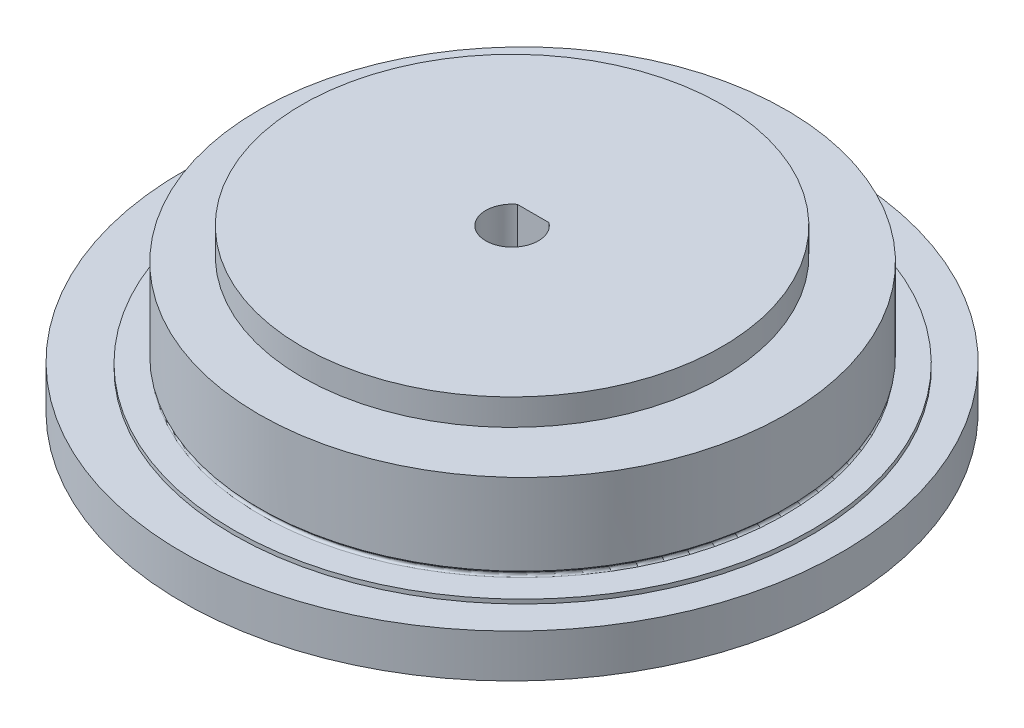
ISO-10303-21;
HEADER;
FILE_DESCRIPTION(('STEP AP214'),'2;1');
FILE_NAME('part.step','',(''),(''),'','','');
FILE_SCHEMA(('AUTOMOTIVE_DESIGN { 1 0 10303 214 1 1 1 1 }'));
ENDSEC;
DATA;
#1=APPLICATION_CONTEXT('core data for automotive mechanical design processes');
#2=APPLICATION_PROTOCOL_DEFINITION('international standard','automotive_design',2000,#1);
#3=PRODUCT_CONTEXT('',#1,'mechanical');
#4=PRODUCT('Part','Part','',(#3));
#5=PRODUCT_RELATED_PRODUCT_CATEGORY('part','',(#4));
#6=PRODUCT_DEFINITION_FORMATION('','',#4);
#7=PRODUCT_DEFINITION_CONTEXT('part definition',#1,'design');
#8=PRODUCT_DEFINITION('design','',#6,#7);
#9=PRODUCT_DEFINITION_SHAPE('','',#8);
#10=(LENGTH_UNIT() NAMED_UNIT(*) SI_UNIT(.MILLI.,.METRE.));
#11=(NAMED_UNIT(*) PLANE_ANGLE_UNIT() SI_UNIT($,.RADIAN.));
#12=(NAMED_UNIT(*) SI_UNIT($,.STERADIAN.) SOLID_ANGLE_UNIT());
#13=UNCERTAINTY_MEASURE_WITH_UNIT(LENGTH_MEASURE(1.E-05),#10,'distance_accuracy_value','');
#14=(GEOMETRIC_REPRESENTATION_CONTEXT(3) GLOBAL_UNCERTAINTY_ASSIGNED_CONTEXT((#13)) GLOBAL_UNIT_ASSIGNED_CONTEXT((#10,
#11,#12)) REPRESENTATION_CONTEXT('',''));
#15=CARTESIAN_POINT('',(0.,0.,0.));
#16=DIRECTION('',(0.,0.,1.));
#17=DIRECTION('',(1.,0.,0.));
#18=AXIS2_PLACEMENT_3D('',#15,#16,#17);
#19=CARTESIAN_POINT('',(0.,10.8,0.));
#20=DIRECTION('',(0.,-1.,0.));
#21=DIRECTION('',(0.,0.,-1.));
#22=AXIS2_PLACEMENT_3D('',#19,#20,#21);
#23=CYLINDRICAL_SURFACE('',#22,25.);
#24=CARTESIAN_POINT('',(0.,8.3,0.));
#25=DIRECTION('',(0.,1.,0.));
#26=DIRECTION('',(0.,0.,1.));
#27=AXIS2_PLACEMENT_3D('',#24,#25,#26);
#28=CIRCLE('',#27,25.);
#29=CARTESIAN_POINT('',(0.,8.3,25.));
#30=VERTEX_POINT('',#29);
#31=EDGE_CURVE('E240',#30,#30,#28,.T.);
#32=ORIENTED_EDGE('',*,*,#31,.F.);
#33=EDGE_LOOP('',(#32));
#34=FACE_BOUND('',#33,.T.);
#35=CARTESIAN_POINT('',(-4.27414110874898,0.600000000000003,-24.6319247681236));
#36=CARTESIAN_POINT('',(-4.34505262191747,0.691030760315778,-24.6196186159859));
#37=CARTESIAN_POINT('',(-4.4121740191949,0.78506279709633,-24.6076576214617));
#38=CARTESIAN_POINT('',(-4.53840363012672,0.978477091958014,-24.5846909681928));
#39=CARTESIAN_POINT('',(-4.59751141349638,1.07785963693054,-24.5736853607583));
#40=CARTESIAN_POINT('',(-4.7072718139828,1.28131024756714,-24.5528961312384));
#41=CARTESIAN_POINT('',(-4.75792463520306,1.38537820004806,-24.5431124796562));
#42=CARTESIAN_POINT('',(-4.85039991708168,1.59748485564613,-24.5250044528434));
#43=CARTESIAN_POINT('',(-4.89222273007305,1.70552340012757,-24.5166800193897));
#44=CARTESIAN_POINT('',(-4.96674980298479,1.92491657348787,-24.5016906246384));
#45=CARTESIAN_POINT('',(-4.99944634811973,2.03627392040853,-24.4950270678499));
#46=CARTESIAN_POINT('',(-5.05542560453281,2.26146789744916,-24.4835350794684));
#47=CARTESIAN_POINT('',(-5.07870483653767,2.37530542754569,-24.4787073261615));
#48=CARTESIAN_POINT('',(-5.11562702937456,2.60449561701758,-24.4710178804894));
#49=CARTESIAN_POINT('',(-5.12927847487715,2.71984685085014,-24.4681544570818));
#50=CARTESIAN_POINT('',(-5.14686935471558,2.95136295802098,-24.4644602879653));
#51=CARTESIAN_POINT('',(-5.15080524504081,3.06752811276799,-24.4636302840016));
#52=CARTESIAN_POINT('',(-5.14893430030416,3.29824295563418,-24.4640241182816));
#53=CARTESIAN_POINT('',(-5.14325528733625,3.41279374175295,-24.4652210106847));
#54=CARTESIAN_POINT('',(-5.12244139795184,3.64103535700627,-24.4695873731959));
#55=CARTESIAN_POINT('',(-5.10730306205712,3.75472585611242,-24.4727575649805));
#56=CARTESIAN_POINT('',(-5.06768622559179,3.98038743179545,-24.4809919648029));
#57=CARTESIAN_POINT('',(-5.04320912181831,4.09235876290378,-24.4860558895933));
#58=CARTESIAN_POINT('',(-4.9851159992354,4.31382161103307,-24.4979485941064));
#59=CARTESIAN_POINT('',(-4.95149657757838,4.42331218822502,-24.5047780309206));
#60=CARTESIAN_POINT('',(-4.83732390974164,4.74673848300007,-24.5276661623403));
#61=CARTESIAN_POINT('',(-4.74339757734062,4.95596045924484,-24.5461374841733));
#62=CARTESIAN_POINT('',(-4.5227540446558,5.35565275867674,-24.5877452666456));
#63=CARTESIAN_POINT('',(-4.39603613067479,5.5461226736073,-24.6108818288198));
#64=CARTESIAN_POINT('',(-4.11071521791974,5.90676024463954,-24.6601561784816));
#65=CARTESIAN_POINT('',(-3.95157934116191,6.07650074478661,-24.6863404920217));
#66=CARTESIAN_POINT('',(-3.607250453221,6.38705434312243,-24.7389980717553));
#67=CARTESIAN_POINT('',(-3.42205463968302,6.527864326257,-24.765471368742));
#68=CARTESIAN_POINT('',(-3.02814172177661,6.77825872054242,-24.8167328104405));
#69=CARTESIAN_POINT('',(-2.81916317887071,6.88743748888901,-24.8414962047766));
#70=CARTESIAN_POINT('',(-2.38536840983069,7.0689962304069,-24.8868945892071));
#71=CARTESIAN_POINT('',(-2.16055310843929,7.14137835018982,-24.9075298200842));
#72=CARTESIAN_POINT('',(-1.70324162679995,7.24665432389415,-24.9429575777453));
#73=CARTESIAN_POINT('',(-1.47081800573248,7.27984824587216,-24.9577939130727));
#74=CARTESIAN_POINT('',(-1.00338412109003,7.30659443751356,-24.9809518044566));
#75=CARTESIAN_POINT('',(-0.768374090071174,7.30015024262091,-24.9892739414596));
#76=CARTESIAN_POINT('',(-0.305976782215305,7.24807286762429,-24.9991825277828));
#77=CARTESIAN_POINT('',(-0.0785286933235555,7.20299567950653,-25.0008626501215));
#78=CARTESIAN_POINT('',(0.365669963290388,7.07566240385783,-24.998312842062));
#79=CARTESIAN_POINT('',(0.582420596264551,6.99340654313916,-24.9940829477181));
#80=CARTESIAN_POINT('',(0.998840107689834,6.7942213745283,-24.9809069424065));
#81=CARTESIAN_POINT('',(1.1985305901376,6.677336782847,-24.9719669021504));
#82=CARTESIAN_POINT('',(1.57565939228854,6.41214847091262,-24.9510124757845));
#83=CARTESIAN_POINT('',(1.75309630349155,6.26384276351202,-24.9389978952233));
#84=CARTESIAN_POINT('',(2.0824717133853,5.93837305310876,-24.9136692514613));
#85=CARTESIAN_POINT('',(2.23414579498077,5.76094273094475,-24.9003436994574));
#86=CARTESIAN_POINT('',(2.50572632966306,5.38303535934477,-24.8744854040156));
#87=CARTESIAN_POINT('',(2.62563193031653,5.18255769169376,-24.8619526818584));
#88=CARTESIAN_POINT('',(2.77924025022984,4.8685946603569,-24.8450893818868));
#89=CARTESIAN_POINT('',(2.82615682313361,4.76143206727769,-24.8397794801961));
#90=CARTESIAN_POINT('',(2.91078910051821,4.54350849652825,-24.8300046089751));
#91=CARTESIAN_POINT('',(2.94850823295193,4.43274887699082,-24.8255393247893));
#92=CARTESIAN_POINT('',(3.01447516230899,4.20838235641678,-24.8176155827845));
#93=CARTESIAN_POINT('',(3.04272024617706,4.09477464977483,-24.8141574134073));
#94=CARTESIAN_POINT('',(3.08951065266847,3.86559296366645,-24.8083752124505));
#95=CARTESIAN_POINT('',(3.10805966195755,3.75001974881413,-24.8060507498326));
#96=CARTESIAN_POINT('',(3.13524983597395,3.51840630033341,-24.8026287983793));
#97=CARTESIAN_POINT('',(3.1439503201434,3.40237313321437,-24.8015239645103));
#98=CARTESIAN_POINT('',(3.15157858223744,3.17002406189209,-24.8005557886724));
#99=CARTESIAN_POINT('',(3.15051002512813,3.05370828008637,-24.8006919811185));
#100=CARTESIAN_POINT('',(3.13861292212023,2.82150851473511,-24.8022003999637));
#101=CARTESIAN_POINT('',(3.1277779646529,2.70562486507169,-24.8035734383427));
#102=CARTESIAN_POINT('',(3.09642619012885,2.47523885085143,-24.807506802285));
#103=CARTESIAN_POINT('',(3.07591294003851,2.36073599333074,-24.8100666904249));
#104=CARTESIAN_POINT('',(3.02543474665135,2.13422501016556,-24.8162726508769));
#105=CARTESIAN_POINT('',(2.99549835705382,2.02221042820814,-24.8199154399868));
#106=CARTESIAN_POINT('',(2.92638642072021,1.80115040351083,-24.8281588497727));
#107=CARTESIAN_POINT('',(2.88721431023388,1.69210387326638,-24.8327591141354));
#108=CARTESIAN_POINT('',(2.79995411501976,1.47780960834962,-24.842749089679));
#109=CARTESIAN_POINT('',(2.75187516575574,1.3725581121927,-24.8481379908013));
#110=CARTESIAN_POINT('',(2.64713353409062,1.16650181044388,-24.8595143885156));
#111=CARTESIAN_POINT('',(2.59047491776958,1.06569492752439,-24.865501601101));
#112=CARTESIAN_POINT('',(2.49043625958997,0.90390576135891,-24.8756765913543));
#113=CARTESIAN_POINT('',(2.4494341190013,0.841432781171271,-24.8797530488686));
#114=CARTESIAN_POINT('',(2.36419516769879,0.718898880698072,-24.8879972834881));
#115=CARTESIAN_POINT('',(2.31996399630949,0.658834026191226,-24.8921648928865));
#116=CARTESIAN_POINT('',(2.27414110874898,0.600000000000004,-24.8963507811386));
#117=B_SPLINE_CURVE_WITH_KNOTS('',3,(#35,#36,#37,#38,#39,#40,#41,#42,#43,#44,#45,#46,#47,#48,
#49,#50,#51,#52,#53,#54,#55,#56,#57,#58,#59,#60,#61,#62,#63,#64,#65,#66,#67,#68,#69,#70,#71,#72,
#73,#74,#75,#76,#77,#78,#79,#80,#81,#82,#83,#84,#85,#86,#87,#88,#89,#90,#91,#92,#93,#94,#95,#96,
#97,#98,#99,#100,#101,#102,#103,#104,#105,#106,#107,#108,#109,#110,#111,#112,#113,#114,#115,
#116),.UNSPECIFIED.,.F.,.F.,(4,2,2,2,2,2,2,2,2,2,2,2,2,2,2,2,2,2,2,2,2,2,2,2,2,2,2,2,2,2,2,2,2,
2,2,2,2,2,2,2,4),(0.,0.348038267559668,0.696095215367474,1.04414375983608,1.39217841392393,
1.74050639016638,2.08896294064228,2.43711202210864,2.78538808158098,3.12907036909893,
3.47287842225977,3.81663507228392,4.1605198469681,4.84729073612463,5.53407657386444,
6.23322463363967,6.93244793382758,7.64027702449846,8.34806481769771,9.05039711241701,
9.75266676489548,10.4449961344176,11.137321280371,11.8287562921967,12.5202350451086,
13.2184303986096,13.9166444846634,14.2676090364982,14.618442580669,14.9693765064011,
15.3201769019224,15.6688529291203,16.0173981519406,16.3661723588763,16.7148181242288,
17.0624174424898,17.4098876361879,17.7570033942441,18.1039551589215,18.3283672214327,
18.5523963276917),.UNSPECIFIED.);
#118=CARTESIAN_POINT('',(-4.27414110874898,0.6,-24.6319247681236));
#119=VERTEX_POINT('',#118);
#120=CARTESIAN_POINT('',(2.27414110874898,0.600000000000003,-24.8963507811386));
#121=VERTEX_POINT('',#120);
#122=EDGE_CURVE('E177',#119,#121,#117,.T.);
#123=ORIENTED_EDGE('',*,*,#122,.F.);
#124=CARTESIAN_POINT('',(0.,0.6,0.));
#125=DIRECTION('',(0.,1.,0.));
#126=DIRECTION('',(0.,0.,1.));
#127=AXIS2_PLACEMENT_3D('',#124,#125,#126);
#128=CIRCLE('',#127,25.);
#129=EDGE_CURVE('E137',#119,#121,#128,.T.);
#130=ORIENTED_EDGE('',*,*,#129,.T.);
#131=EDGE_LOOP('',(#123,#130));
#132=FACE_BOUND('',#131,.T.);
#133=ADVANCED_FACE('F41',(#34,#132),#23,.T.);
#134=CARTESIAN_POINT('',(-1.,0.,0.));
#135=DIRECTION('',(0.,-1.,0.));
#136=DIRECTION('',(0.,0.,-1.));
#137=AXIS2_PLACEMENT_3D('',#134,#135,#136);
#138=PLANE('',#137);
#139=DIRECTION('',(0.,0.,1.));
#140=VECTOR('',#139,1.);
#141=CARTESIAN_POINT('',(1.70185121722126,0.,-31.25));
#142=LINE('',#141,#140);
#143=CARTESIAN_POINT('',(1.70185121719412,-2.32889956620022E-11,-24.824575804788));
#144=VERTEX_POINT('',#143);
#145=CARTESIAN_POINT('',(1.70185121722126,0.,-27.3470967825552));
#146=VERTEX_POINT('',#145);
#147=EDGE_CURVE('E337',#144,#146,#142,.F.);
#148=ORIENTED_EDGE('',*,*,#147,.F.);
#149=CARTESIAN_POINT('',(0.,0.,0.));
#150=DIRECTION('',(0.,-1.,0.));
#151=DIRECTION('',(0.,0.,-1.));
#152=AXIS2_PLACEMENT_3D('',#149,#150,#151);
#153=CIRCLE('',#152,24.8828427124746);
#154=CARTESIAN_POINT('',(-3.70185121722126,0.,-24.6059374749126));
#155=VERTEX_POINT('',#154);
#156=EDGE_CURVE('E129',#144,#155,#153,.T.);
#157=ORIENTED_EDGE('',*,*,#156,.T.);
#158=DIRECTION('',(0.,0.,1.));
#159=VECTOR('',#158,1.);
#160=CARTESIAN_POINT('',(-3.70185121722126,0.,-31.25));
#161=LINE('',#160,#159);
#162=CARTESIAN_POINT('',(-3.70185121722126,0.,-27.1487807749364));
#163=VERTEX_POINT('',#162);
#164=EDGE_CURVE('E62',#163,#155,#161,.T.);
#165=ORIENTED_EDGE('',*,*,#164,.F.);
#166=CARTESIAN_POINT('',(0.,0.,0.));
#167=DIRECTION('',(0.,1.,0.));
#168=DIRECTION('',(0.,0.,1.));
#169=AXIS2_PLACEMENT_3D('',#166,#167,#168);
#170=CIRCLE('',#169,27.4);
#171=EDGE_CURVE('E260',#163,#146,#170,.T.);
#172=ORIENTED_EDGE('',*,*,#171,.T.);
#173=EDGE_LOOP('',(#148,#157,#165,#172));
#174=FACE_BOUND('',#173,.T.);
#175=ADVANCED_FACE('F214',(#174),#138,.F.);
#176=CARTESIAN_POINT('',(-1.,-2.,0.));
#177=DIRECTION('',(0.,1.,0.));
#178=DIRECTION('',(0.,0.,1.));
#179=AXIS2_PLACEMENT_3D('',#176,#177,#178);
#180=CYLINDRICAL_SURFACE('',#179,31.25);
#181=CARTESIAN_POINT('',(-1.,-4.5,0.));
#182=DIRECTION('',(0.,-1.,0.));
#183=DIRECTION('',(0.,0.,-1.));
#184=AXIS2_PLACEMENT_3D('',#181,#182,#183);
#185=CIRCLE('',#184,31.25);
#186=CARTESIAN_POINT('',(-1.,-4.5,-31.25));
#187=VERTEX_POINT('',#186);
#188=EDGE_CURVE('E258',#187,#187,#185,.T.);
#189=ORIENTED_EDGE('',*,*,#188,.F.);
#190=EDGE_LOOP('',(#189));
#191=FACE_BOUND('',#190,.T.);
#192=CARTESIAN_POINT('',(1.14941852602047,-0.4,-31.1759923659216));
#193=CARTESIAN_POINT('',(1.05018927384685,-0.46009450659294,-31.1828379795394));
#194=CARTESIAN_POINT('',(0.948412663402869,-0.516017189269527,-31.1893748836995));
#195=CARTESIAN_POINT('',(0.740498763905845,-0.619164885281527,-31.2016655987921));
#196=CARTESIAN_POINT('',(0.634361494396882,-0.666389937593728,-31.2074194132337));
#197=CARTESIAN_POINT('',(0.418549865240858,-0.751753118082809,-31.217973915197));
#198=CARTESIAN_POINT('',(0.308878543868644,-0.789898827111896,-31.2227753973119));
#199=CARTESIAN_POINT('',(0.0866899916221706,-0.85687733633233,-31.231297739614));
#200=CARTESIAN_POINT('',(-0.0258271614023855,-0.885710390981336,-31.2350186293269));
#201=CARTESIAN_POINT('',(-0.252963747038846,-0.933860981084216,-31.2412763893917));
#202=CARTESIAN_POINT('',(-0.367584077148125,-0.953174351376509,-31.2438127414458));
#203=CARTESIAN_POINT('',(-0.598101605263813,-0.982127336717654,-31.247628223645));
#204=CARTESIAN_POINT('',(-0.713999233476503,-0.991763585087078,-31.2489069162461));
#205=CARTESIAN_POINT('',(-0.946201630625096,-1.00127786827916,-31.2501693693157));
#206=CARTESIAN_POINT('',(-1.06250640030056,-1.00115588536714,-31.2501531274306));
#207=CARTESIAN_POINT('',(-1.29468823026529,-0.991154528256743,-31.2488261602018));
#208=CARTESIAN_POINT('',(-1.41056529082343,-0.98127516019325,-31.2475154356718));
#209=CARTESIAN_POINT('',(-1.6406867581142,-0.951881541155404,-31.2436428930292));
#210=CARTESIAN_POINT('',(-1.7549352409594,-0.93239864111939,-31.2410851461422));
#211=CARTESIAN_POINT('',(-1.9813329672195,-0.883965859779933,-31.234793180704));
#212=CARTESIAN_POINT('',(-2.09348294005519,-0.855019335081593,-31.2310593792988));
#213=CARTESIAN_POINT('',(-2.3148054602762,-0.787911294930692,-31.2225245612551));
#214=CARTESIAN_POINT('',(-2.42398124070208,-0.749760269432725,-31.2177247599801));
#215=CARTESIAN_POINT('',(-2.63868616580703,-0.664516648439489,-31.2071906854103));
#216=CARTESIAN_POINT('',(-2.74421721287012,-0.617428803543969,-31.2014569088231));
#217=CARTESIAN_POINT('',(-2.89904318432458,-0.540453049966208,-31.1922875069476));
#218=CARTESIAN_POINT('',(-2.94998313499199,-0.513791811600203,-31.1891425363875));
#219=CARTESIAN_POINT('',(-3.05062518607747,-0.458424705550807,-31.1826871070559));
#220=CARTESIAN_POINT('',(-3.10032908965055,-0.429722084635024,-31.1793769134621));
#221=CARTESIAN_POINT('',(-3.14941852602047,-0.400000000000001,-31.1759923659216));
#222=B_SPLINE_CURVE_WITH_KNOTS('',3,(#192,#193,#194,#195,#196,#197,#198,#199,#200,#201,#202,
#203,#204,#205,#206,#207,#208,#209,#210,#211,#212,#213,#214,#215,#216,#217,#218,#219,#220,#221),
.UNSPECIFIED.,.F.,.F.,(4,2,2,2,2,2,2,2,2,2,2,2,2,2,4),(0.,0.348526314591998,0.697051067291212,
1.04528378823434,1.3935069933105,1.74188242205719,2.09037900898526,2.43887622927331,
2.78737323044635,3.1347400159154,3.4819837290399,3.82883355812322,4.17549952393379,
4.34820013053028,4.52063195216404),.UNSPECIFIED.);
#223=CARTESIAN_POINT('',(1.14941852602047,-0.4,-31.1759923659216));
#224=VERTEX_POINT('',#223);
#225=CARTESIAN_POINT('',(-3.14941852602047,-0.4,-31.1759923659216));
#226=VERTEX_POINT('',#225);
#227=EDGE_CURVE('E198',#224,#226,#222,.T.);
#228=ORIENTED_EDGE('',*,*,#227,.F.);
#229=CARTESIAN_POINT('',(-1.,-0.4,0.));
#230=DIRECTION('',(0.,1.,0.));
#231=DIRECTION('',(0.,0.,1.));
#232=AXIS2_PLACEMENT_3D('',#229,#230,#231);
#233=CIRCLE('',#232,31.25);
#234=EDGE_CURVE('E251',#226,#224,#233,.T.);
#235=ORIENTED_EDGE('',*,*,#234,.F.);
#236=EDGE_LOOP('',(#228,#235));
#237=FACE_BOUND('',#236,.T.);
#238=ADVANCED_FACE('F208',(#191,#237),#180,.T.);
#239=CARTESIAN_POINT('',(-1.,-0.4,0.));
#240=DIRECTION('',(0.,1.,0.));
#241=DIRECTION('',(0.,0.,1.));
#242=AXIS2_PLACEMENT_3D('',#239,#240,#241);
#243=PLANE('',#242);
#244=CARTESIAN_POINT('',(0.,-0.4,0.));
#245=DIRECTION('',(0.,1.,0.));
#246=DIRECTION('',(0.,0.,1.));
#247=AXIS2_PLACEMENT_3D('',#244,#245,#246);
#248=CIRCLE('',#247,27.4);
#249=CARTESIAN_POINT('',(-3.14941852602047,-0.4,-27.2183975088167));
#250=VERTEX_POINT('',#249);
#251=CARTESIAN_POINT('',(1.14941852602047,-0.4,-27.3758805712627));
#252=VERTEX_POINT('',#251);
#253=EDGE_CURVE('E252',#250,#252,#248,.T.);
#254=ORIENTED_EDGE('',*,*,#253,.F.);
#255=DIRECTION('',(0.,0.,1.));
#256=VECTOR('',#255,1.);
#257=CARTESIAN_POINT('',(-3.14941852602047,-0.4,-31.25));
#258=LINE('',#257,#256);
#259=EDGE_CURVE('E206',#250,#226,#258,.F.);
#260=ORIENTED_EDGE('',*,*,#259,.T.);
#261=ORIENTED_EDGE('',*,*,#234,.T.);
#262=DIRECTION('',(0.,0.,1.));
#263=VECTOR('',#262,1.);
#264=CARTESIAN_POINT('',(1.14941852602047,-0.4,-31.25));
#265=LINE('',#264,#263);
#266=EDGE_CURVE('E205',#224,#252,#265,.T.);
#267=ORIENTED_EDGE('',*,*,#266,.T.);
#268=EDGE_LOOP('',(#254,#260,#261,#267));
#269=FACE_BOUND('',#268,.T.);
#270=ADVANCED_FACE('F213',(#269),#243,.T.);
#271=CARTESIAN_POINT('',(0.,-0.4,0.));
#272=DIRECTION('',(0.,1.,0.));
#273=DIRECTION('',(0.,0.,1.));
#274=AXIS2_PLACEMENT_3D('',#271,#272,#273);
#275=CYLINDRICAL_SURFACE('',#274,27.4);
#276=ORIENTED_EDGE('',*,*,#253,.T.);
#277=CARTESIAN_POINT('',(1.14941852602047,-0.4,-27.3758805712627));
#278=CARTESIAN_POINT('',(1.19814672388348,-0.370497298783021,-27.3738348315652));
#279=CARTESIAN_POINT('',(1.24626343045633,-0.33999225494623,-27.371684056658));
#280=CARTESIAN_POINT('',(1.34111440217854,-0.277085497584228,-27.3672004402564));
#281=CARTESIAN_POINT('',(1.38785087093337,-0.244687084272305,-27.364867913328));
#282=CARTESIAN_POINT('',(1.47994747923183,-0.178001308188629,-27.3600417039824));
#283=CARTESIAN_POINT('',(1.52530761989637,-0.143713946955346,-27.3575480216965));
#284=CARTESIAN_POINT('',(1.61465245293751,-0.0732493384597245,-27.3524204552876));
#285=CARTESIAN_POINT('',(1.65863468095811,-0.0370689832753103,-27.3497863404586));
#286=CARTESIAN_POINT('',(1.70185121722126,0.,-27.3470967825552));
#287=B_SPLINE_CURVE_WITH_KNOTS('',3,(#277,#278,#279,#280,#281,#282,#283,#284,#285,#286),
.UNSPECIFIED.,.F.,.F.,(4,2,2,2,4),(0.,0.170988414191285,0.341687198249359,0.512385843282325,
0.683374118345813),.UNSPECIFIED.);
#288=EDGE_CURVE('E329',#252,#146,#287,.T.);
#289=ORIENTED_EDGE('',*,*,#288,.T.);
#290=ORIENTED_EDGE('',*,*,#171,.F.);
#291=CARTESIAN_POINT('',(-3.70185121722126,0.,-27.1487807749364));
#292=CARTESIAN_POINT('',(-3.65863223797171,-0.0370709929362275,-27.15467399862));
#293=CARTESIAN_POINT('',(-3.61464949838679,-0.0732517016414285,-27.1605659782806));
#294=CARTESIAN_POINT('',(-3.52530482471149,-0.143716118559753,-27.1723066889708));
#295=CARTESIAN_POINT('',(-3.47994532076019,-0.178002898771038,-27.1781554758585));
#296=CARTESIAN_POINT('',(-3.38785033608361,-0.244687443882914,-27.189788965842));
#297=CARTESIAN_POINT('',(-3.34111485468591,-0.277085207860336,-27.1955736689064));
#298=CARTESIAN_POINT('',(-3.24626503361679,-0.33999118130589,-27.2070588613527));
#299=CARTESIAN_POINT('',(-3.19814851478667,-0.370496133740836,-27.2127591933881));
#300=CARTESIAN_POINT('',(-3.14941852602047,-0.4,-27.2183975088167));
#301=B_SPLINE_CURVE_WITH_KNOTS('',3,(#291,#292,#293,#294,#295,#296,#297,#298,#299,#300),
.UNSPECIFIED.,.F.,.F.,(4,2,2,2,4),(0.,0.171719775982543,0.343152305044937,0.514584917886311,
0.686304777597735),.UNSPECIFIED.);
#302=EDGE_CURVE('E190',#163,#250,#301,.T.);
#303=ORIENTED_EDGE('',*,*,#302,.T.);
#304=EDGE_LOOP('',(#276,#289,#290,#303));
#305=FACE_BOUND('',#304,.T.);
#306=ADVANCED_FACE('F323',(#305),#275,.T.);
#307=CARTESIAN_POINT('',(0.,0.,0.));
#308=DIRECTION('',(0.,1.,0.));
#309=DIRECTION('',(0.,0.,1.));
#310=AXIS2_PLACEMENT_3D('',#307,#308,#309);
#311=CONICAL_SURFACE('',#310,24.4,0.785398163397448);
#312=CARTESIAN_POINT('',(2.29427019171517,0.626057864376269,-24.920672071967));
#313=CARTESIAN_POINT('',(2.27392900846743,0.599508458971209,-24.8958829988227));
#314=CARTESIAN_POINT('',(2.2531919320739,0.573106999586338,-24.8712596057359));
#315=CARTESIAN_POINT('',(2.21093105908702,0.520635807820277,-24.822373560428));
#316=CARTESIAN_POINT('',(2.18940767389965,0.494565911321243,-24.7981107286468));
#317=CARTESIAN_POINT('',(2.14555815792449,0.442766104398859,-24.7499494481037));
#318=CARTESIAN_POINT('',(2.12323202294885,0.417036195750143,-24.7260510012437));
#319=CARTESIAN_POINT('',(2.07776039228808,0.365927184240608,-24.6786240839202));
#320=CARTESIAN_POINT('',(2.05461447960442,0.340548269318759,-24.6550958108033));
#321=CARTESIAN_POINT('',(2.03106183815602,0.315363491861036,-24.6317677064478));
#322=B_SPLINE_CURVE_WITH_KNOTS('',3,(#312,#313,#314,#315,#316,#317,#318,#319,#320,#321),
.UNSPECIFIED.,.F.,.F.,(4,2,2,2,4),(0.,0.124890883779666,0.249717333601537,0.374544434722109,
0.4994359705895),.UNSPECIFIED.);
#323=CARTESIAN_POINT('',(2.05522274176534,0.341421356237307,-24.6559118713668));
#324=VERTEX_POINT('',#323);
#325=EDGE_CURVE('E184',#121,#324,#322,.T.);
#326=ORIENTED_EDGE('',*,*,#325,.F.);
#327=ORIENTED_EDGE('',*,*,#129,.F.);
#328=CARTESIAN_POINT('',(-2.85378173257471,-0.562949405522828,-23.6656060743537));
#329=CARTESIAN_POINT('',(-2.94396953546774,-0.517922832947247,-23.7000825865135));
#330=CARTESIAN_POINT('',(-3.03160531294395,-0.470060573115263,-23.7372624128411));
#331=CARTESIAN_POINT('',(-3.20149691224425,-0.36932634427192,-23.8165896279831));
#332=CARTESIAN_POINT('',(-3.28375663924454,-0.316458081561992,-23.8587333472257));
#333=CARTESIAN_POINT('',(-3.52121067562615,-0.1519504798089,-23.9914531657831));
#334=CARTESIAN_POINT('',(-3.66826507559421,-0.0338023614604547,-24.0887802355815));
#335=CARTESIAN_POINT('',(-3.88350610369192,0.16342773730264,-24.2545894941912));
#336=CARTESIAN_POINT('',(-3.95920418184625,0.238521848615174,-24.3184102590742));
#337=CARTESIAN_POINT('',(-4.12535547143996,0.416197252677352,-24.4710300798322));
#338=CARTESIAN_POINT('',(-4.21303611915418,0.520040162989596,-24.5614064048201));
#339=CARTESIAN_POINT('',(-4.39988871175294,0.763899441995798,-24.7763984188401));
#340=CARTESIAN_POINT('',(-4.49460958438149,0.905417406806121,-24.9031485450419));
#341=CARTESIAN_POINT('',(-4.66351767914875,1.19324780553088,-25.1648334889058));
#342=CARTESIAN_POINT('',(-4.73769698372053,1.33956206390092,-25.2997714381297));
#343=CARTESIAN_POINT('',(-4.80220057692622,1.48693933579621,-25.43761973523));
#344=B_SPLINE_CURVE_WITH_KNOTS('',3,(#328,#329,#330,#331,#332,#333,#334,#335,#336,#337,#338,
#339,#340,#341,#342,#343),.UNSPECIFIED.,.F.,.F.,(4,2,2,2,2,2,2,4),(0.,0.319354188641467,
0.638473758270904,1.2725338942728,1.64505496947552,2.13388757910416,2.76945557597409,
3.40526820704223),.UNSPECIFIED.);
#345=CARTESIAN_POINT('',(-4.0552227417654,0.341421356237368,-24.4068248496511));
#346=VERTEX_POINT('',#345);
#347=EDGE_CURVE('E123',#346,#119,#344,.T.);
#348=ORIENTED_EDGE('',*,*,#347,.F.);
#349=CARTESIAN_POINT('',(0.,0.341421356237305,0.));
#350=DIRECTION('',(0.,1.,0.));
#351=DIRECTION('',(0.,0.,1.));
#352=AXIS2_PLACEMENT_3D('',#349,#350,#351);
#353=CIRCLE('',#352,24.7414213562373);
#354=EDGE_CURVE('E135',#346,#324,#353,.T.);
#355=ORIENTED_EDGE('',*,*,#354,.T.);
#356=EDGE_LOOP('',(#326,#327,#348,#355));
#357=FACE_BOUND('',#356,.T.);
#358=ADVANCED_FACE('F134',(#357),#311,.T.);
#359=CARTESIAN_POINT('',(0.,0.2,0.));
#360=DIRECTION('',(0.,-1.,0.));
#361=DIRECTION('',(0.,0.,-1.));
#362=AXIS2_PLACEMENT_3D('',#359,#360,#361);
#363=TOROIDAL_SURFACE('',#362,24.8828427124746,0.2);
#364=CARTESIAN_POINT('',(2.05540658395203,0.341621356237275,-24.6560975242611));
#365=CARTESIAN_POINT('',(2.04576000307225,0.331118823397935,-24.6463749432405));
#366=CARTESIAN_POINT('',(2.03539681455163,0.319959507893397,-24.6383018401848));
#367=CARTESIAN_POINT('',(2.01378647193673,0.296961941648518,-24.6251805771533));
#368=CARTESIAN_POINT('',(2.00254865630067,0.285131152461071,-24.6201043941848));
#369=CARTESIAN_POINT('',(1.97723359046507,0.258809714129522,-24.6117726788602));
#370=CARTESIAN_POINT('',(1.9630384478143,0.244260927494847,-24.6090854429148));
#371=CARTESIAN_POINT('',(1.93426708073297,0.215209344081728,-24.6069774437458));
#372=CARTESIAN_POINT('',(1.91968947818595,0.200707015345089,-24.607570800603));
#373=CARTESIAN_POINT('',(1.89023885819476,0.171837127579066,-24.6118204509488));
#374=CARTESIAN_POINT('',(1.87536616999824,0.157479036891126,-24.6155417891554));
#375=CARTESIAN_POINT('',(1.84599269821855,0.129530633503324,-24.6260159443818));
#376=CARTESIAN_POINT('',(1.83149148291491,0.115939405193726,-24.6327650562503));
#377=CARTESIAN_POINT('',(1.80590502771457,0.0922814740533255,-24.6478257545431));
#378=CARTESIAN_POINT('',(1.79468482304452,0.0820284238669655,-24.6556158679522));
#379=CARTESIAN_POINT('',(1.77313158748574,0.0625332956390624,-24.6733962684549));
#380=CARTESIAN_POINT('',(1.76279716134885,0.0532896211261297,-24.6833830035807));
#381=CARTESIAN_POINT('',(1.74678481305251,0.0390921751381243,-24.7020380940133));
#382=CARTESIAN_POINT('',(1.74069895295775,0.0337321255742371,-24.7100459796267));
#383=CARTESIAN_POINT('',(1.72945890806399,0.0238826751277219,-24.727183499845));
#384=CARTESIAN_POINT('',(1.72430349805759,0.0193921287155291,-24.7363116322981));
#385=CARTESIAN_POINT('',(1.71635166715108,0.0124922726586149,-24.7534026873911));
#386=CARTESIAN_POINT('',(1.71328549049882,0.00984182393301942,-24.7611410815372));
#387=CARTESIAN_POINT('',(1.708134564232,0.00539846778055729,-24.7771711325353));
#388=CARTESIAN_POINT('',(1.70604844573673,0.00360436421078626,-24.7854619991248));
#389=CARTESIAN_POINT('',(1.70304624898473,0.00102475016597417,-24.802498212033));
#390=CARTESIAN_POINT('',(1.70214151057756,0.000249014441554505,-24.8112471365356));
#391=CARTESIAN_POINT('',(1.70168050651186,-0.000146442785135503,-24.8288170439638));
#392=CARTESIAN_POINT('',(1.70212450409218,0.000234061381126608,-24.8376380406208));
#393=CARTESIAN_POINT('',(1.70405311330371,0.00188980429800365,-24.8526702187647));
#394=CARTESIAN_POINT('',(1.70523093808858,0.00290135119111294,-24.8589537985375));
#395=CARTESIAN_POINT('',(1.70824316374556,0.00549327742844698,-24.8712373674798));
#396=CARTESIAN_POINT('',(1.71007721257457,0.00707335177852416,-24.8772375067559));
#397=CARTESIAN_POINT('',(1.71220761612713,0.00891263301513812,-24.8830427124745));
#398=B_SPLINE_CURVE_WITH_KNOTS('',3,(#364,#365,#366,#367,#368,#369,#370,#371,#372,#373,#374,
#375,#376,#377,#378,#379,#380,#381,#382,#383,#384,#385,#386,#387,#388,#389,#390,#391,#392,#393,
#394,#395,#396,#397),.UNSPECIFIED.,.F.,.F.,(4,2,2,2,2,2,2,2,2,2,2,2,2,2,2,2,4),(0.,
0.0514856535220932,0.102481931005455,0.163692275619762,0.22516628172803,0.28795116893972,
0.350659433639746,0.401744641772937,0.452747843876913,0.486843024647042,0.520892976342735,
0.54700416288636,0.573078769812338,0.599401865650121,0.625730099414706,0.645084562245177,
0.664428657558403),.UNSPECIFIED.);
#399=EDGE_CURVE('E12',#324,#144,#398,.T.);
#400=ORIENTED_EDGE('',*,*,#399,.F.);
#401=ORIENTED_EDGE('',*,*,#354,.F.);
#402=CARTESIAN_POINT('',(-4.05540658395206,0.341621356237306,-24.6932672155393));
#403=CARTESIAN_POINT('',(-4.04666192406541,0.332103388217681,-24.7043499212799));
#404=CARTESIAN_POINT('',(-4.03725059402866,0.321957178846357,-24.7142801988077));
#405=CARTESIAN_POINT('',(-4.01743582188537,0.300827615709064,-24.7318690091321));
#406=CARTESIAN_POINT('',(-4.00703756465247,0.289848691841366,-24.7395386304527));
#407=CARTESIAN_POINT('',(-3.9845740134931,0.26640751157595,-24.7533143157438));
#408=CARTESIAN_POINT('',(-3.97244222492099,0.253898769914969,-24.7592300408397));
#409=CARTESIAN_POINT('',(-3.94753154558764,0.228549291503818,-24.7686237886991));
#410=CARTESIAN_POINT('',(-3.93475094081974,0.215707724487221,-24.7720949513169));
#411=CARTESIAN_POINT('',(-3.90618694179355,0.187389866038221,-24.7770255605851));
#412=CARTESIAN_POINT('',(-3.89031701253162,0.171903607773925,-24.7779393360443));
#413=CARTESIAN_POINT('',(-3.85844634159315,0.141300930189173,-24.7760368763756));
#414=CARTESIAN_POINT('',(-3.84244581288963,0.126184025814469,-24.7732258344538));
#415=CARTESIAN_POINT('',(-3.81630829171381,0.101867803316271,-24.7651244051366));
#416=CARTESIAN_POINT('',(-3.80603910402282,0.0924142391406873,-24.7610121715785));
#417=CARTESIAN_POINT('',(-3.78596481099622,0.0741126648385099,-24.750779129516));
#418=CARTESIAN_POINT('',(-3.77615897316202,0.065263688333077,-24.7446616215475));
#419=CARTESIAN_POINT('',(-3.76003558676774,0.0508409857124646,-24.7321729320714));
#420=CARTESIAN_POINT('',(-3.75350472333031,0.0450394479752634,-24.7263424363231));
#421=CARTESIAN_POINT('',(-3.74115962705138,0.0341355522439664,-24.7134004256567));
#422=CARTESIAN_POINT('',(-3.73534433686223,0.0290321613739071,-24.7062908399767));
#423=CARTESIAN_POINT('',(-3.7259395009839,0.020817353935381,-24.6924776462557));
#424=CARTESIAN_POINT('',(-3.72214198428297,0.0175148846530285,-24.6860307104621));
#425=CARTESIAN_POINT('',(-3.71538637521784,0.0116569930323792,-24.6723964482906));
#426=CARTESIAN_POINT('',(-3.71242755732239,0.00910092494838229,-24.6652097692231));
#427=CARTESIAN_POINT('',(-3.7075192635364,0.00486881247623859,-24.6501890704784));
#428=CARTESIAN_POINT('',(-3.70557700819222,0.0031990623653202,-24.6423508662732));
#429=CARTESIAN_POINT('',(-3.70286063729617,0.000865563085619536,-24.6263302735392));
#430=CARTESIAN_POINT('',(-3.70208615850803,0.00020150109781778,-24.6181479928496));
#431=CARTESIAN_POINT('',(-3.70172844467208,-0.000105291071759455,-24.6026228899999));
#432=CARTESIAN_POINT('',(-3.70202660380935,0.000150290736276309,-24.5952839333695));
#433=CARTESIAN_POINT('',(-3.703480917993,0.00139843679111964,-24.5807581112065));
#434=CARTESIAN_POINT('',(-3.70463743367529,0.00239131080912558,-24.5735713109077));
#435=CARTESIAN_POINT('',(-3.70827626190948,0.00552112778608141,-24.5568127129126));
#436=CARTESIAN_POINT('',(-3.71109482763616,0.00794896763025341,-24.547368634041));
#437=CARTESIAN_POINT('',(-3.7178319535266,0.0137746761731569,-24.5292005420769));
#438=CARTESIAN_POINT('',(-3.72175289502871,0.0171746451259324,-24.5204781413321));
#439=CARTESIAN_POINT('',(-3.73244029833909,0.0264859034205162,-24.4999294224838));
#440=CARTESIAN_POINT('',(-3.73968174537232,0.0328294928535239,-24.4885481322373));
#441=CARTESIAN_POINT('',(-3.75533665864946,0.0466582496471967,-24.4674118726732));
#442=CARTESIAN_POINT('',(-3.76375253360921,0.0541457662378252,-24.457660338634));
#443=CARTESIAN_POINT('',(-3.78542331422816,0.0736037655458134,-24.4355611432571));
#444=CARTESIAN_POINT('',(-3.79912647366746,0.0860546208698228,-24.4240758740282));
#445=CARTESIAN_POINT('',(-3.82750384400748,0.112221747673031,-24.4041762281298));
#446=CARTESIAN_POINT('',(-3.84217914509043,0.125939446851503,-24.3957653704738));
#447=CARTESIAN_POINT('',(-3.87243184242058,0.154656802291945,-24.3818584558961));
#448=CARTESIAN_POINT('',(-3.88802255326987,0.169679706683629,-24.3764392664397));
#449=CARTESIAN_POINT('',(-3.91938531281367,0.200395008933764,-24.3690831580091));
#450=CARTESIAN_POINT('',(-3.93515728206369,0.216087121087514,-24.3671447679168));
#451=CARTESIAN_POINT('',(-3.96238481594457,0.243619260387742,-24.3672376779747));
#452=CARTESIAN_POINT('',(-3.97389996214794,0.255403926873225,-24.3683705746048));
#453=CARTESIAN_POINT('',(-3.99650994651101,0.278817241091715,-24.3731284277062));
#454=CARTESIAN_POINT('',(-4.00760640052626,0.290446345412268,-24.3767424799655));
#455=CARTESIAN_POINT('',(-4.02485296456279,0.308722937454578,-24.3848542215703));
#456=CARTESIAN_POINT('',(-4.0312424004462,0.315542288688441,-24.3884556229342));
#457=CARTESIAN_POINT('',(-4.04364693685401,0.328865827414008,-24.3968256089106));
#458=CARTESIAN_POINT('',(-4.04966002293451,0.335368283445435,-24.401599895574));
#459=CARTESIAN_POINT('',(-4.05540658395204,0.341621356237277,-24.4069973325287));
#460=B_SPLINE_CURVE_WITH_KNOTS('',3,(#402,#403,#404,#405,#406,#407,#408,#409,#410,#411,#412,
#413,#414,#415,#416,#417,#418,#419,#420,#421,#422,#423,#424,#425,#426,#427,#428,#429,#430,#431,
#432,#433,#434,#435,#436,#437,#438,#439,#440,#441,#442,#443,#444,#445,#446,#447,#448,#449,#450,
#451,#452,#453,#454,#455,#456,#457,#458,#459),.UNSPECIFIED.,.F.,.F.,(4,2,2,2,2,2,2,2,2,2,2,2,2,
2,2,2,2,2,2,2,2,2,2,2,2,2,2,2,4),(0.,0.0509325530086513,0.10161095767353,0.15663272264357,
0.211808285782482,0.278091586240249,0.344282570516284,0.387814786232287,0.431275707873993,
0.462685696196031,0.494048700381093,0.518490184223397,0.542910459547026,0.567501913152964,
0.592085716021707,0.614038818434904,0.636001149603154,0.666282279825389,0.696629332306695,
0.741101983027466,0.785667224308649,0.85068476689504,0.91577649812269,0.982470922240879,
1.0491371521241,1.09853046869085,1.14770808895746,1.17768025672255,1.20780112411164),.UNSPECIFIED.);
#461=EDGE_CURVE('E55',#155,#346,#460,.T.);
#462=ORIENTED_EDGE('',*,*,#461,.F.);
#463=ORIENTED_EDGE('',*,*,#156,.F.);
#464=EDGE_LOOP('',(#400,#401,#462,#463));
#465=FACE_BOUND('',#464,.T.);
#466=ADVANCED_FACE('F43',(#465),#363,.F.);
#467=CARTESIAN_POINT('',(-1.,3.15,31.251));
#468=DIRECTION('',(0.,0.,-1.));
#469=DIRECTION('',(-1.,0.,0.));
#470=AXIS2_PLACEMENT_3D('',#467,#468,#469);
#471=CYLINDRICAL_SURFACE('',#470,2.15);
#472=CARTESIAN_POINT('',(0.5,4.69029218007494,-2.));
#473=CARTESIAN_POINT('',(0.547555969378583,4.64394936849016,-1.96434506707204));
#474=CARTESIAN_POINT('',(0.592658192652131,4.59576359273632,-1.92785727162388));
#475=CARTESIAN_POINT('',(0.678018553164502,4.49577248535761,-1.85403029983135));
#476=CARTESIAN_POINT('',(0.718272012312123,4.44396373323749,-1.81669034197521));
#477=CARTESIAN_POINT('',(0.794407774724675,4.3361736336715,-1.74155096876577));
#478=CARTESIAN_POINT('',(0.830225179507015,4.28014613947688,-1.7037520126904));
#479=CARTESIAN_POINT('',(0.89678573499304,4.16447262471734,-1.6293230908048));
#480=CARTESIAN_POINT('',(0.927532094427976,4.10482892525849,-1.59269239769933));
#481=CARTESIAN_POINT('',(0.988072019815987,3.97229016321078,-1.51666262880082));
#482=CARTESIAN_POINT('',(1.01701567464629,3.89875641273936,-1.47768479016229));
#483=CARTESIAN_POINT('',(1.06724787957816,3.74615674242745,-1.40654669447473));
#484=CARTESIAN_POINT('',(1.08856376163685,3.66711181246618,-1.37436226876584));
#485=CARTESIAN_POINT('',(1.11848245721527,3.52235111863976,-1.32763853961327));
#486=CARTESIAN_POINT('',(1.12888743521284,3.45779782200245,-1.31073782524072));
#487=CARTESIAN_POINT('',(1.14377079499359,3.32634239394009,-1.28625882428155));
#488=CARTESIAN_POINT('',(1.14826387343571,3.25944651314431,-1.27865742343021));
#489=CARTESIAN_POINT('',(1.15091018083715,3.12482982350286,-1.27420420440891));
#490=CARTESIAN_POINT('',(1.14903336734199,3.05710661077693,-1.2774033245874));
#491=CARTESIAN_POINT('',(1.13907703469895,2.92334799900739,-1.29399884942352));
#492=CARTESIAN_POINT('',(1.13098545249229,2.85731614081713,-1.30741508539027));
#493=CARTESIAN_POINT('',(1.10513869248463,2.70384715592242,-1.34876688396163));
#494=CARTESIAN_POINT('',(1.0848767061218,2.6178362444274,-1.38028625629394));
#495=CARTESIAN_POINT('',(1.03539323225681,2.45197011732439,-1.45227012204852));
#496=CARTESIAN_POINT('',(1.00611210537702,2.37216044393264,-1.49279364322151));
#497=CARTESIAN_POINT('',(0.944264786897997,2.22940899892124,-1.57226366955723));
#498=CARTESIAN_POINT('',(0.912744081290164,2.16567562440267,-1.61062675460717));
#499=CARTESIAN_POINT('',(0.844022951003984,2.04226762022524,-1.68887342994163));
#500=CARTESIAN_POINT('',(0.806818041222073,1.98259624990073,-1.72875820209766));
#501=CARTESIAN_POINT('',(0.727682127001445,1.86846303233985,-1.80780934894279));
#502=CARTESIAN_POINT('',(0.685869778275055,1.81391682755448,-1.84697275657276));
#503=CARTESIAN_POINT('',(0.596930714680164,1.70881454862094,-1.92439581324874));
#504=CARTESIAN_POINT('',(0.549810966797845,1.65825338825214,-1.96265656916787));
#505=CARTESIAN_POINT('',(0.50000000000005,1.60970781992511,-2.00000000000012));
#506=B_SPLINE_CURVE_WITH_KNOTS('',3,(#472,#473,#474,#475,#476,#477,#478,#479,#480,#481,#482,
#483,#484,#485,#486,#487,#488,#489,#490,#491,#492,#493,#494,#495,#496,#497,#498,#499,#500,#501,
#502,#503,#504,#505),.UNSPECIFIED.,.F.,.F.,(4,2,2,2,2,2,2,2,2,2,2,2,2,2,2,2,4),(0.,
0.226010333310533,0.452237004076822,0.681457586270981,0.910532566793242,1.17430939036074,
1.43713135007331,1.63897501926863,1.84031596214233,2.04260781051187,2.24529330905291,
2.52517654016274,2.80695175207818,3.04899290505596,3.29122603571055,3.52825702480067,
3.76498041352293),.UNSPECIFIED.);
#507=CARTESIAN_POINT('',(0.5,4.69029218007494,-2.));
#508=VERTEX_POINT('',#507);
#509=CARTESIAN_POINT('',(0.5,1.60970781992506,-2.));
#510=VERTEX_POINT('',#509);
#511=EDGE_CURVE('E293',#508,#510,#506,.T.);
#512=ORIENTED_EDGE('',*,*,#511,.F.);
#513=CARTESIAN_POINT('',(-1.,3.15,-2.));
#514=DIRECTION('',(0.,0.,1.));
#515=DIRECTION('',(1.,0.,0.));
#516=AXIS2_PLACEMENT_3D('',#513,#514,#515);
#517=CIRCLE('',#516,2.15);
#518=CARTESIAN_POINT('',(-2.5,4.69029218007494,-2.));
#519=VERTEX_POINT('',#518);
#520=EDGE_CURVE('E336',#519,#508,#517,.F.);
#521=ORIENTED_EDGE('',*,*,#520,.F.);
#522=CARTESIAN_POINT('',(-2.5,1.60970781992506,-2.));
#523=CARTESIAN_POINT('',(-2.54755596937858,1.65605063150984,-1.96434506707204));
#524=CARTESIAN_POINT('',(-2.59265819265213,1.70423640726368,-1.92785727162388));
#525=CARTESIAN_POINT('',(-2.6780185531645,1.80422751464239,-1.85403029983135));
#526=CARTESIAN_POINT('',(-2.71827201231212,1.8560362667625,-1.81669034197521));
#527=CARTESIAN_POINT('',(-2.79440777472467,1.9638263663285,-1.74155096876578));
#528=CARTESIAN_POINT('',(-2.83022517950701,2.01985386052312,-1.70375201269041));
#529=CARTESIAN_POINT('',(-2.89678573499304,2.13552737528266,-1.6293230908048));
#530=CARTESIAN_POINT('',(-2.92753209442797,2.19517107474151,-1.59269239769933));
#531=CARTESIAN_POINT('',(-2.98807201981599,2.32770983678921,-1.51666262880082));
#532=CARTESIAN_POINT('',(-3.01701567464629,2.40124358726064,-1.47768479016229));
#533=CARTESIAN_POINT('',(-3.06724787957816,2.55384325757255,-1.40654669447473));
#534=CARTESIAN_POINT('',(-3.08856376163685,2.63288818753382,-1.37436226876584));
#535=CARTESIAN_POINT('',(-3.11848245721526,2.77764888136024,-1.32763853961327));
#536=CARTESIAN_POINT('',(-3.12888743521284,2.84220217799754,-1.31073782524072));
#537=CARTESIAN_POINT('',(-3.14377079499359,2.97365760605991,-1.28625882428155));
#538=CARTESIAN_POINT('',(-3.14826387343571,3.04055348685569,-1.27865742343021));
#539=CARTESIAN_POINT('',(-3.15091018083715,3.17517017649714,-1.27420420440891));
#540=CARTESIAN_POINT('',(-3.14903336734199,3.24289338922307,-1.2774033245874));
#541=CARTESIAN_POINT('',(-3.13907703469895,3.37665200099261,-1.29399884942352));
#542=CARTESIAN_POINT('',(-3.13098545249229,3.44268385918287,-1.30741508539027));
#543=CARTESIAN_POINT('',(-3.10513869248463,3.59615284407758,-1.34876688396163));
#544=CARTESIAN_POINT('',(-3.0848767061218,3.6821637555726,-1.38028625629394));
#545=CARTESIAN_POINT('',(-3.03539323225681,3.84802988267561,-1.45227012204852));
#546=CARTESIAN_POINT('',(-3.00611210537702,3.92783955606736,-1.49279364322151));
#547=CARTESIAN_POINT('',(-2.944264786898,4.07059100107876,-1.57226366955723));
#548=CARTESIAN_POINT('',(-2.91274408129016,4.13432437559733,-1.61062675460717));
#549=CARTESIAN_POINT('',(-2.84402295100398,4.25773237977476,-1.68887342994163));
#550=CARTESIAN_POINT('',(-2.80681804122207,4.31740375009927,-1.72875820209766));
#551=CARTESIAN_POINT('',(-2.72768212700145,4.43153696766015,-1.80780934894279));
#552=CARTESIAN_POINT('',(-2.68586977827505,4.48608317244553,-1.84697275657276));
#553=CARTESIAN_POINT('',(-2.59693071468016,4.59118545137906,-1.92439581324874));
#554=CARTESIAN_POINT('',(-2.54981096679785,4.64174661174786,-1.96265656916787));
#555=CARTESIAN_POINT('',(-2.50000000000005,4.69029218007489,-2.00000000000012));
#556=B_SPLINE_CURVE_WITH_KNOTS('',3,(#522,#523,#524,#525,#526,#527,#528,#529,#530,#531,#532,
#533,#534,#535,#536,#537,#538,#539,#540,#541,#542,#543,#544,#545,#546,#547,#548,#549,#550,#551,
#552,#553,#554,#555),.UNSPECIFIED.,.F.,.F.,(4,2,2,2,2,2,2,2,2,2,2,2,2,2,2,2,4),(0.,
0.226010333310532,0.45223700407682,0.681457586270977,0.910532566793238,1.17430939036074,
1.43713135007331,1.63897501926863,1.84031596214233,2.04260781051187,2.24529330905291,
2.52517654016274,2.80695175207818,3.04899290505596,3.29122603571055,3.52825702480066,
3.76498041352293),.UNSPECIFIED.);
#557=CARTESIAN_POINT('',(-2.5,1.60970781992507,-2.));
#558=VERTEX_POINT('',#557);
#559=EDGE_CURVE('E70',#558,#519,#556,.T.);
#560=ORIENTED_EDGE('',*,*,#559,.F.);
#561=EDGE_CURVE('E340',#510,#558,#517,.F.);
#562=ORIENTED_EDGE('',*,*,#561,.F.);
#563=EDGE_LOOP('',(#512,#521,#560,#562));
#564=FACE_BOUND('',#563,.T.);
#565=CARTESIAN_POINT('',(-1.,3.15,-9.));
#566=DIRECTION('',(0.,0.,-1.));
#567=DIRECTION('',(-1.,0.,0.));
#568=AXIS2_PLACEMENT_3D('',#565,#566,#567);
#569=CIRCLE('',#568,2.15);
#570=CARTESIAN_POINT('',(-3.15,3.15,-9.));
#571=VERTEX_POINT('',#570);
#572=EDGE_CURVE('E138',#571,#571,#569,.F.);
#573=ORIENTED_EDGE('',*,*,#572,.F.);
#574=EDGE_LOOP('',(#573));
#575=FACE_BOUND('',#574,.T.);
#576=ADVANCED_FACE('F351',(#564,#575),#471,.F.);
#577=CARTESIAN_POINT('',(-2.5,10.8,-2.));
#578=DIRECTION('',(0.,0.,1.));
#579=DIRECTION('',(1.,0.,0.));
#580=AXIS2_PLACEMENT_3D('',#577,#578,#579);
#581=PLANE('',#580);
#582=ORIENTED_EDGE('',*,*,#520,.T.);
#583=DIRECTION('',(0.,-1.,0.));
#584=VECTOR('',#583,1.);
#585=CARTESIAN_POINT('',(0.500000000000001,10.8,-2.));
#586=LINE('',#585,#584);
#587=CARTESIAN_POINT('',(0.500000000000001,10.8,-2.));
#588=VERTEX_POINT('',#587);
#589=EDGE_CURVE('E278',#588,#508,#586,.T.);
#590=ORIENTED_EDGE('',*,*,#589,.F.);
#591=DIRECTION('',(-1.,0.,0.));
#592=VECTOR('',#591,1.);
#593=CARTESIAN_POINT('',(-2.5,10.8,-2.));
#594=LINE('',#593,#592);
#595=CARTESIAN_POINT('',(-2.5,10.8,-2.));
#596=VERTEX_POINT('',#595);
#597=EDGE_CURVE('E281',#588,#596,#594,.T.);
#598=ORIENTED_EDGE('',*,*,#597,.T.);
#599=DIRECTION('',(0.,-1.,0.));
#600=VECTOR('',#599,1.);
#601=CARTESIAN_POINT('',(-2.5,10.8,-2.));
#602=LINE('',#601,#600);
#603=EDGE_CURVE('E284',#596,#519,#602,.T.);
#604=ORIENTED_EDGE('',*,*,#603,.T.);
#605=EDGE_LOOP('',(#582,#590,#598,#604));
#606=FACE_BOUND('',#605,.T.);
#607=ADVANCED_FACE('F223',(#606),#581,.T.);
#608=CARTESIAN_POINT('',(0.,10.8,0.));
#609=DIRECTION('',(0.,1.,0.));
#610=DIRECTION('',(0.,0.,1.));
#611=AXIS2_PLACEMENT_3D('',#608,#609,#610);
#612=PLANE('',#611);
#613=ORIENTED_EDGE('',*,*,#597,.F.);
#614=CARTESIAN_POINT('',(-1.,10.8,0.));
#615=DIRECTION('',(0.,1.,0.));
#616=DIRECTION('',(0.,0.,1.));
#617=AXIS2_PLACEMENT_3D('',#614,#615,#616);
#618=CIRCLE('',#617,2.5);
#619=EDGE_CURVE('E275',#596,#588,#618,.T.);
#620=ORIENTED_EDGE('',*,*,#619,.F.);
#621=EDGE_LOOP('',(#613,#620));
#622=FACE_BOUND('',#621,.T.);
#623=CARTESIAN_POINT('',(-1.,10.8,0.));
#624=DIRECTION('',(0.,1.,0.));
#625=DIRECTION('',(0.,0.,1.));
#626=AXIS2_PLACEMENT_3D('',#623,#624,#625);
#627=CIRCLE('',#626,19.9);
#628=CARTESIAN_POINT('',(-1.,10.8,19.9));
#629=VERTEX_POINT('',#628);
#630=EDGE_CURVE('E373',#629,#629,#627,.T.);
#631=ORIENTED_EDGE('',*,*,#630,.T.);
#632=EDGE_LOOP('',(#631));
#633=FACE_BOUND('',#632,.T.);
#634=ADVANCED_FACE('F226',(#622,#633),#612,.T.);
#635=CARTESIAN_POINT('',(-1.,10.8,0.));
#636=DIRECTION('',(0.,-1.,0.));
#637=DIRECTION('',(0.,0.,-1.));
#638=AXIS2_PLACEMENT_3D('',#635,#636,#637);
#639=CYLINDRICAL_SURFACE('',#638,2.5);
#640=ORIENTED_EDGE('',*,*,#559,.T.);
#641=ORIENTED_EDGE('',*,*,#603,.F.);
#642=ORIENTED_EDGE('',*,*,#619,.T.);
#643=ORIENTED_EDGE('',*,*,#589,.T.);
#644=ORIENTED_EDGE('',*,*,#511,.T.);
#645=CARTESIAN_POINT('',(0.5,-4.5,-2.));
#646=VERTEX_POINT('',#645);
#647=EDGE_CURVE('E286',#510,#646,#586,.T.);
#648=ORIENTED_EDGE('',*,*,#647,.T.);
#649=CARTESIAN_POINT('',(-1.,-4.5,0.));
#650=DIRECTION('',(0.,-1.,0.));
#651=DIRECTION('',(0.,0.,-1.));
#652=AXIS2_PLACEMENT_3D('',#649,#650,#651);
#653=CIRCLE('',#652,2.5);
#654=CARTESIAN_POINT('',(-2.5,-4.5,-2.));
#655=VERTEX_POINT('',#654);
#656=EDGE_CURVE('E266',#655,#646,#653,.F.);
#657=ORIENTED_EDGE('',*,*,#656,.F.);
#658=EDGE_CURVE('E283',#558,#655,#602,.T.);
#659=ORIENTED_EDGE('',*,*,#658,.F.);
#660=EDGE_LOOP('',(#640,#641,#642,#643,#644,#648,#657,#659));
#661=FACE_BOUND('',#660,.T.);
#662=ADVANCED_FACE('F221',(#661),#639,.F.);
#663=ORIENTED_EDGE('',*,*,#561,.T.);
#664=ORIENTED_EDGE('',*,*,#658,.T.);
#665=DIRECTION('',(-1.,0.,0.));
#666=VECTOR('',#665,1.);
#667=CARTESIAN_POINT('',(0.,-4.5,-2.));
#668=LINE('',#667,#666);
#669=EDGE_CURVE('E269',#646,#655,#668,.T.);
#670=ORIENTED_EDGE('',*,*,#669,.F.);
#671=ORIENTED_EDGE('',*,*,#647,.F.);
#672=EDGE_LOOP('',(#663,#664,#670,#671));
#673=FACE_BOUND('',#672,.T.);
#674=ADVANCED_FACE('F217',(#673),#581,.T.);
#675=CARTESIAN_POINT('',(-1.,-2.,0.));
#676=DIRECTION('',(0.,-1.,0.));
#677=DIRECTION('',(0.,0.,-1.));
#678=AXIS2_PLACEMENT_3D('',#675,#676,#677);
#679=PLANE('',#678);
#680=CARTESIAN_POINT('',(-1.,-2.,0.));
#681=DIRECTION('',(0.,-1.,0.));
#682=DIRECTION('',(0.,0.,-1.));
#683=AXIS2_PLACEMENT_3D('',#680,#681,#682);
#684=CIRCLE('',#683,30.1);
#685=CARTESIAN_POINT('',(-1.,-2.,-30.1));
#686=VERTEX_POINT('',#685);
#687=EDGE_CURVE('E141',#686,#686,#684,.F.);
#688=ORIENTED_EDGE('',*,*,#687,.F.);
#689=EDGE_LOOP('',(#688));
#690=FACE_BOUND('',#689,.T.);
#691=CARTESIAN_POINT('',(-1.,-2.,0.));
#692=DIRECTION('',(0.,-1.,0.));
#693=DIRECTION('',(0.,0.,-1.));
#694=AXIS2_PLACEMENT_3D('',#691,#692,#693);
#695=CIRCLE('',#694,19.9);
#696=CARTESIAN_POINT('',(-1.,-2.,-19.9));
#697=VERTEX_POINT('',#696);
#698=EDGE_CURVE('E145',#697,#697,#695,.T.);
#699=ORIENTED_EDGE('',*,*,#698,.F.);
#700=EDGE_LOOP('',(#699));
#701=FACE_BOUND('',#700,.T.);
#702=ADVANCED_FACE('F220',(#690,#701),#679,.T.);
#703=CARTESIAN_POINT('',(-1.,-4.5,0.));
#704=DIRECTION('',(0.,1.,0.));
#705=DIRECTION('',(0.,0.,1.));
#706=AXIS2_PLACEMENT_3D('',#703,#704,#705);
#707=CYLINDRICAL_SURFACE('',#706,19.9);
#708=CARTESIAN_POINT('',(-1.,-4.5,0.));
#709=DIRECTION('',(0.,-1.,0.));
#710=DIRECTION('',(0.,0.,-1.));
#711=AXIS2_PLACEMENT_3D('',#708,#709,#710);
#712=CIRCLE('',#711,19.9);
#713=CARTESIAN_POINT('',(-1.,-4.5,-19.9));
#714=VERTEX_POINT('',#713);
#715=EDGE_CURVE('E272',#714,#714,#712,.T.);
#716=ORIENTED_EDGE('',*,*,#715,.F.);
#717=EDGE_LOOP('',(#716));
#718=FACE_BOUND('',#717,.T.);
#719=ORIENTED_EDGE('',*,*,#698,.T.);
#720=EDGE_LOOP('',(#719));
#721=FACE_BOUND('',#720,.T.);
#722=ADVANCED_FACE('F299',(#718,#721),#707,.T.);
#723=CARTESIAN_POINT('',(0.,-4.5,0.));
#724=DIRECTION('',(0.,-1.,0.));
#725=DIRECTION('',(0.,0.,-1.));
#726=AXIS2_PLACEMENT_3D('',#723,#724,#725);
#727=PLANE('',#726);
#728=ORIENTED_EDGE('',*,*,#656,.T.);
#729=ORIENTED_EDGE('',*,*,#669,.T.);
#730=EDGE_LOOP('',(#728,#729));
#731=FACE_BOUND('',#730,.T.);
#732=ORIENTED_EDGE('',*,*,#715,.T.);
#733=EDGE_LOOP('',(#732));
#734=FACE_BOUND('',#733,.T.);
#735=ADVANCED_FACE('F295',(#731,#734),#727,.T.);
#736=CARTESIAN_POINT('',(-1.,-4.5,0.));
#737=DIRECTION('',(0.,1.,0.));
#738=DIRECTION('',(0.,0.,1.));
#739=AXIS2_PLACEMENT_3D('',#736,#737,#738);
#740=CYLINDRICAL_SURFACE('',#739,30.1);
#741=CARTESIAN_POINT('',(-1.,-4.5,0.));
#742=DIRECTION('',(0.,-1.,0.));
#743=DIRECTION('',(0.,0.,-1.));
#744=AXIS2_PLACEMENT_3D('',#741,#742,#743);
#745=CIRCLE('',#744,30.1);
#746=CARTESIAN_POINT('',(-1.,-4.5,-30.1));
#747=VERTEX_POINT('',#746);
#748=EDGE_CURVE('E255',#747,#747,#745,.T.);
#749=ORIENTED_EDGE('',*,*,#748,.T.);
#750=EDGE_LOOP('',(#749));
#751=FACE_BOUND('',#750,.T.);
#752=ORIENTED_EDGE('',*,*,#687,.T.);
#753=EDGE_LOOP('',(#752));
#754=FACE_BOUND('',#753,.T.);
#755=ADVANCED_FACE('F298',(#751,#754),#740,.F.);
#756=CARTESIAN_POINT('',(0.,-4.5,0.));
#757=DIRECTION('',(0.,-1.,0.));
#758=DIRECTION('',(0.,0.,-1.));
#759=AXIS2_PLACEMENT_3D('',#756,#757,#758);
#760=PLANE('',#759);
#761=ORIENTED_EDGE('',*,*,#748,.F.);
#762=EDGE_LOOP('',(#761));
#763=FACE_BOUND('',#762,.T.);
#764=ORIENTED_EDGE('',*,*,#188,.T.);
#765=EDGE_LOOP('',(#764));
#766=FACE_BOUND('',#765,.T.);
#767=ADVANCED_FACE('F316',(#763,#766),#760,.T.);
#768=CARTESIAN_POINT('',(0.,8.3,0.));
#769=DIRECTION('',(0.,1.,0.));
#770=DIRECTION('',(0.,0.,1.));
#771=AXIS2_PLACEMENT_3D('',#768,#769,#770);
#772=PLANE('',#771);
#773=CARTESIAN_POINT('',(-1.,8.3,0.));
#774=DIRECTION('',(0.,1.,0.));
#775=DIRECTION('',(0.,0.,1.));
#776=AXIS2_PLACEMENT_3D('',#773,#774,#775);
#777=CIRCLE('',#776,19.9);
#778=CARTESIAN_POINT('',(-1.,8.3,19.9));
#779=VERTEX_POINT('',#778);
#780=EDGE_CURVE('E370',#779,#779,#777,.T.);
#781=ORIENTED_EDGE('',*,*,#780,.F.);
#782=EDGE_LOOP('',(#781));
#783=FACE_BOUND('',#782,.T.);
#784=ORIENTED_EDGE('',*,*,#31,.T.);
#785=EDGE_LOOP('',(#784));
#786=FACE_BOUND('',#785,.T.);
#787=ADVANCED_FACE('F320',(#783,#786),#772,.T.);
#788=CARTESIAN_POINT('',(-1.,8.3,0.));
#789=DIRECTION('',(0.,1.,0.));
#790=DIRECTION('',(0.,0.,1.));
#791=AXIS2_PLACEMENT_3D('',#788,#789,#790);
#792=CYLINDRICAL_SURFACE('',#791,19.9);
#793=ORIENTED_EDGE('',*,*,#780,.T.);
#794=EDGE_LOOP('',(#793));
#795=FACE_BOUND('',#794,.T.);
#796=ORIENTED_EDGE('',*,*,#630,.F.);
#797=EDGE_LOOP('',(#796));
#798=FACE_BOUND('',#797,.T.);
#799=ADVANCED_FACE('F357',(#795,#798),#792,.T.);
#800=CARTESIAN_POINT('',(-1.,3.15,-9.));
#801=DIRECTION('',(0.,0.,-1.));
#802=DIRECTION('',(-1.,0.,0.));
#803=AXIS2_PLACEMENT_3D('',#800,#801,#802);
#804=PLANE('',#803);
#805=CARTESIAN_POINT('',(-1.,3.15,-9.));
#806=DIRECTION('',(0.,0.,-1.));
#807=DIRECTION('',(-1.,0.,0.));
#808=AXIS2_PLACEMENT_3D('',#805,#806,#807);
#809=CIRCLE('',#808,4.15);
#810=CARTESIAN_POINT('',(-5.15,3.15,-9.));
#811=VERTEX_POINT('',#810);
#812=EDGE_CURVE('E150',#811,#811,#809,.T.);
#813=ORIENTED_EDGE('',*,*,#812,.T.);
#814=EDGE_LOOP('',(#813));
#815=FACE_BOUND('',#814,.T.);
#816=ORIENTED_EDGE('',*,*,#572,.T.);
#817=EDGE_LOOP('',(#816));
#818=FACE_BOUND('',#817,.T.);
#819=ADVANCED_FACE('F159',(#815,#818),#804,.T.);
#820=CARTESIAN_POINT('',(-1.,3.15,-31.25));
#821=DIRECTION('',(0.,0.,1.));
#822=DIRECTION('',(1.,0.,0.));
#823=AXIS2_PLACEMENT_3D('',#820,#821,#822);
#824=CYLINDRICAL_SURFACE('',#823,4.15);
#825=ORIENTED_EDGE('',*,*,#266,.F.);
#826=ORIENTED_EDGE('',*,*,#227,.T.);
#827=ORIENTED_EDGE('',*,*,#259,.F.);
#828=ORIENTED_EDGE('',*,*,#302,.F.);
#829=ORIENTED_EDGE('',*,*,#164,.T.);
#830=ORIENTED_EDGE('',*,*,#461,.T.);
#831=ORIENTED_EDGE('',*,*,#347,.T.);
#832=ORIENTED_EDGE('',*,*,#122,.T.);
#833=ORIENTED_EDGE('',*,*,#325,.T.);
#834=ORIENTED_EDGE('',*,*,#399,.T.);
#835=ORIENTED_EDGE('',*,*,#147,.T.);
#836=ORIENTED_EDGE('',*,*,#288,.F.);
#837=EDGE_LOOP('',(#825,#826,#827,#828,#829,#830,#831,#832,#833,#834,#835,#836));
#838=FACE_BOUND('',#837,.T.);
#839=ORIENTED_EDGE('',*,*,#812,.F.);
#840=EDGE_LOOP('',(#839));
#841=FACE_BOUND('',#840,.T.);
#842=ADVANCED_FACE('F121',(#838,#841),#824,.F.);
#843=CLOSED_SHELL('',(#133,#175,#238,#270,#306,#358,#466,#576,#607,#634,#662,#674,#702,#722,
#735,#755,#767,#787,#799,#819,#842));
#844=MANIFOLD_SOLID_BREP('B2',#843);
#845=ADVANCED_BREP_SHAPE_REPRESENTATION('',(#18,#844),#14);
#846=SHAPE_DEFINITION_REPRESENTATION(#9,#845);
ENDSEC;
END-ISO-10303-21;
